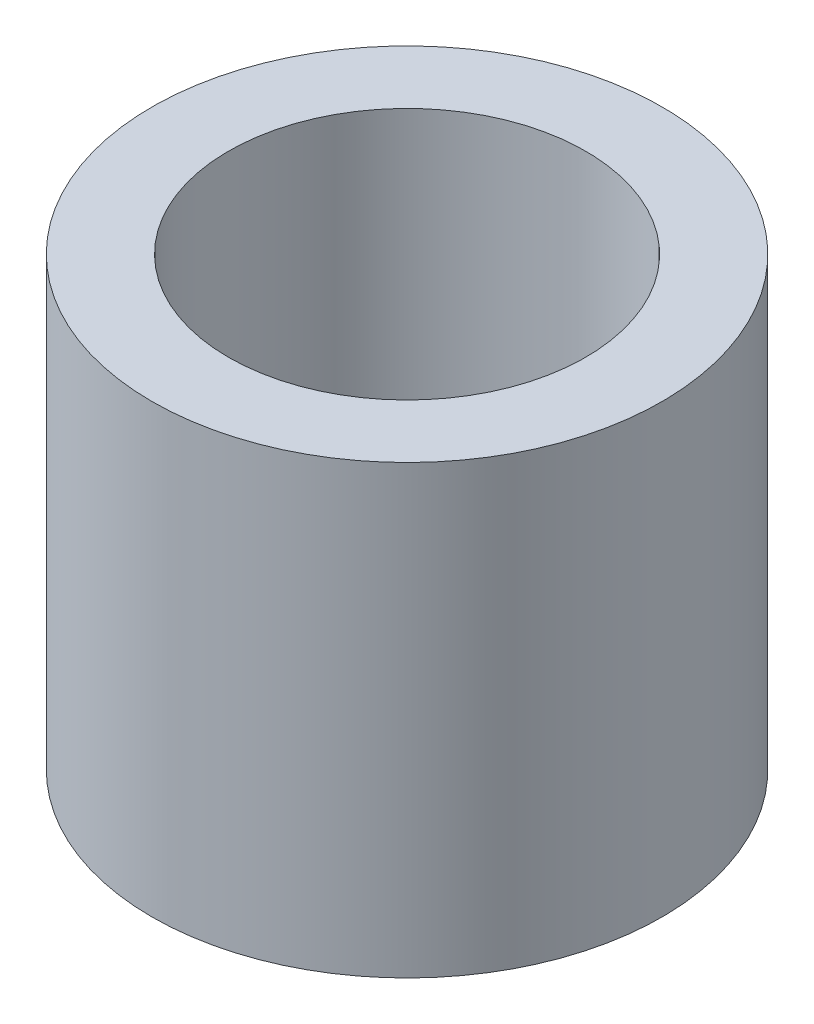
ISO-10303-21;
HEADER;
FILE_DESCRIPTION(('STEP AP214'),'2;1');
FILE_NAME('part.step','',(''),(''),'','','');
FILE_SCHEMA(('AUTOMOTIVE_DESIGN { 1 0 10303 214 1 1 1 1 }'));
ENDSEC;
DATA;
#1=APPLICATION_CONTEXT('core data for automotive mechanical design processes');
#2=APPLICATION_PROTOCOL_DEFINITION('international standard','automotive_design',2000,#1);
#3=PRODUCT_CONTEXT('',#1,'mechanical');
#4=PRODUCT('Part','Part','',(#3));
#5=PRODUCT_RELATED_PRODUCT_CATEGORY('part','',(#4));
#6=PRODUCT_DEFINITION_FORMATION('','',#4);
#7=PRODUCT_DEFINITION_CONTEXT('part definition',#1,'design');
#8=PRODUCT_DEFINITION('design','',#6,#7);
#9=PRODUCT_DEFINITION_SHAPE('','',#8);
#10=(LENGTH_UNIT() NAMED_UNIT(*) SI_UNIT(.MILLI.,.METRE.));
#11=(NAMED_UNIT(*) PLANE_ANGLE_UNIT() SI_UNIT($,.RADIAN.));
#12=(NAMED_UNIT(*) SI_UNIT($,.STERADIAN.) SOLID_ANGLE_UNIT());
#13=UNCERTAINTY_MEASURE_WITH_UNIT(LENGTH_MEASURE(1.E-05),#10,'distance_accuracy_value','');
#14=(GEOMETRIC_REPRESENTATION_CONTEXT(3) GLOBAL_UNCERTAINTY_ASSIGNED_CONTEXT((#13)) GLOBAL_UNIT_ASSIGNED_CONTEXT((#10,
#11,#12)) REPRESENTATION_CONTEXT('',''));
#15=CARTESIAN_POINT('',(0.,0.,0.));
#16=DIRECTION('',(0.,0.,1.));
#17=DIRECTION('',(1.,0.,0.));
#18=AXIS2_PLACEMENT_3D('',#15,#16,#17);
#19=CARTESIAN_POINT('',(0.,5.55625,0.));
#20=DIRECTION('',(0.,1.,0.));
#21=DIRECTION('',(0.,0.,1.));
#22=AXIS2_PLACEMENT_3D('',#19,#20,#21);
#23=PLANE('',#22);
#24=CARTESIAN_POINT('',(0.,5.55625,0.));
#25=DIRECTION('',(0.,1.,0.));
#26=DIRECTION('',(0.,0.,1.));
#27=AXIS2_PLACEMENT_3D('',#24,#25,#26);
#28=CIRCLE('',#27,6.35);
#29=CARTESIAN_POINT('',(0.,5.55625,6.35));
#30=VERTEX_POINT('',#29);
#31=EDGE_CURVE('E10',#30,#30,#28,.T.);
#32=ORIENTED_EDGE('',*,*,#31,.T.);
#33=EDGE_LOOP('',(#32));
#34=FACE_BOUND('',#33,.T.);
#35=CARTESIAN_POINT('',(0.,5.55625,0.));
#36=DIRECTION('',(0.,1.,0.));
#37=DIRECTION('',(0.,0.,1.));
#38=AXIS2_PLACEMENT_3D('',#35,#36,#37);
#39=CIRCLE('',#38,4.445);
#40=CARTESIAN_POINT('',(0.,5.55625,4.445));
#41=VERTEX_POINT('',#40);
#42=EDGE_CURVE('E44',#41,#41,#39,.T.);
#43=ORIENTED_EDGE('',*,*,#42,.F.);
#44=EDGE_LOOP('',(#43));
#45=FACE_BOUND('',#44,.T.);
#46=ADVANCED_FACE('F33',(#34,#45),#23,.T.);
#47=CARTESIAN_POINT('',(0.,-5.55625,0.));
#48=DIRECTION('',(0.,1.,0.));
#49=DIRECTION('',(0.,0.,1.));
#50=AXIS2_PLACEMENT_3D('',#47,#48,#49);
#51=PLANE('',#50);
#52=CARTESIAN_POINT('',(0.,-5.55625,0.));
#53=DIRECTION('',(0.,1.,0.));
#54=DIRECTION('',(0.,0.,1.));
#55=AXIS2_PLACEMENT_3D('',#52,#53,#54);
#56=CIRCLE('',#55,6.35);
#57=CARTESIAN_POINT('',(0.,-5.55625,6.35));
#58=VERTEX_POINT('',#57);
#59=EDGE_CURVE('E37',#58,#58,#56,.T.);
#60=ORIENTED_EDGE('',*,*,#59,.F.);
#61=EDGE_LOOP('',(#60));
#62=FACE_BOUND('',#61,.T.);
#63=CARTESIAN_POINT('',(0.,-5.55625,0.));
#64=DIRECTION('',(0.,1.,0.));
#65=DIRECTION('',(0.,0.,1.));
#66=AXIS2_PLACEMENT_3D('',#63,#64,#65);
#67=CIRCLE('',#66,4.445);
#68=CARTESIAN_POINT('',(0.,-5.55625,4.445));
#69=VERTEX_POINT('',#68);
#70=EDGE_CURVE('E46',#69,#69,#67,.T.);
#71=ORIENTED_EDGE('',*,*,#70,.T.);
#72=EDGE_LOOP('',(#71));
#73=FACE_BOUND('',#72,.T.);
#74=ADVANCED_FACE('F56',(#62,#73),#51,.F.);
#75=CARTESIAN_POINT('',(0.,5.55625,0.));
#76=DIRECTION('',(0.,-1.,0.));
#77=DIRECTION('',(0.,0.,-1.));
#78=AXIS2_PLACEMENT_3D('',#75,#76,#77);
#79=CYLINDRICAL_SURFACE('',#78,6.35);
#80=ORIENTED_EDGE('',*,*,#31,.F.);
#81=EDGE_LOOP('',(#80));
#82=FACE_BOUND('',#81,.T.);
#83=ORIENTED_EDGE('',*,*,#59,.T.);
#84=EDGE_LOOP('',(#83));
#85=FACE_BOUND('',#84,.T.);
#86=ADVANCED_FACE('F35',(#82,#85),#79,.T.);
#87=CARTESIAN_POINT('',(0.,5.55625,0.));
#88=DIRECTION('',(0.,-1.,0.));
#89=DIRECTION('',(0.,0.,-1.));
#90=AXIS2_PLACEMENT_3D('',#87,#88,#89);
#91=CYLINDRICAL_SURFACE('',#90,4.445);
#92=ORIENTED_EDGE('',*,*,#42,.T.);
#93=EDGE_LOOP('',(#92));
#94=FACE_BOUND('',#93,.T.);
#95=ORIENTED_EDGE('',*,*,#70,.F.);
#96=EDGE_LOOP('',(#95));
#97=FACE_BOUND('',#96,.T.);
#98=ADVANCED_FACE('F52',(#94,#97),#91,.F.);
#99=CLOSED_SHELL('',(#46,#74,#86,#98));
#100=MANIFOLD_SOLID_BREP('B2',#99);
#101=ADVANCED_BREP_SHAPE_REPRESENTATION('',(#18,#100),#14);
#102=SHAPE_DEFINITION_REPRESENTATION(#9,#101);
ENDSEC;
END-ISO-10303-21;
